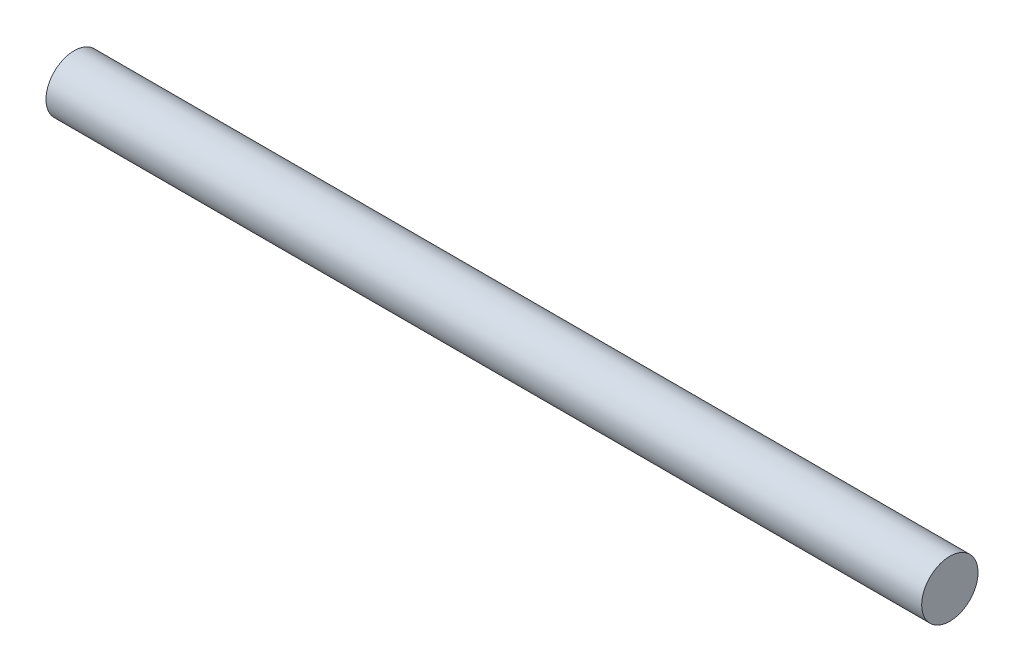
ISO-10303-21;
HEADER;
FILE_DESCRIPTION(('STEP AP214'),'2;1');
FILE_NAME('part.step','',(''),(''),'','','');
FILE_SCHEMA(('AUTOMOTIVE_DESIGN { 1 0 10303 214 1 1 1 1 }'));
ENDSEC;
DATA;
#1=APPLICATION_CONTEXT('core data for automotive mechanical design processes');
#2=APPLICATION_PROTOCOL_DEFINITION('international standard','automotive_design',2000,#1);
#3=PRODUCT_CONTEXT('',#1,'mechanical');
#4=PRODUCT('Part','Part','',(#3));
#5=PRODUCT_RELATED_PRODUCT_CATEGORY('part','',(#4));
#6=PRODUCT_DEFINITION_FORMATION('','',#4);
#7=PRODUCT_DEFINITION_CONTEXT('part definition',#1,'design');
#8=PRODUCT_DEFINITION('design','',#6,#7);
#9=PRODUCT_DEFINITION_SHAPE('','',#8);
#10=(LENGTH_UNIT() NAMED_UNIT(*) SI_UNIT(.MILLI.,.METRE.));
#11=(NAMED_UNIT(*) PLANE_ANGLE_UNIT() SI_UNIT($,.RADIAN.));
#12=(NAMED_UNIT(*) SI_UNIT($,.STERADIAN.) SOLID_ANGLE_UNIT());
#13=UNCERTAINTY_MEASURE_WITH_UNIT(LENGTH_MEASURE(1.E-05),#10,'distance_accuracy_value','');
#14=(GEOMETRIC_REPRESENTATION_CONTEXT(3) GLOBAL_UNCERTAINTY_ASSIGNED_CONTEXT((#13)) GLOBAL_UNIT_ASSIGNED_CONTEXT((#10,
#11,#12)) REPRESENTATION_CONTEXT('',''));
#15=CARTESIAN_POINT('',(0.,0.,0.));
#16=DIRECTION('',(0.,0.,1.));
#17=DIRECTION('',(1.,0.,0.));
#18=AXIS2_PLACEMENT_3D('',#15,#16,#17);
#19=CARTESIAN_POINT('',(0.,0.,0.));
#20=DIRECTION('',(-1.,0.,0.));
#21=DIRECTION('',(0.,0.,1.));
#22=AXIS2_PLACEMENT_3D('',#19,#20,#21);
#23=PLANE('',#22);
#24=CARTESIAN_POINT('',(0.,0.,0.));
#25=DIRECTION('',(-1.,0.,0.));
#26=DIRECTION('',(0.,0.,1.));
#27=AXIS2_PLACEMENT_3D('',#24,#25,#26);
#28=CIRCLE('',#27,8.5);
#29=CARTESIAN_POINT('',(0.,0.,8.5));
#30=VERTEX_POINT('',#29);
#31=EDGE_CURVE('E10',#30,#30,#28,.T.);
#32=ORIENTED_EDGE('',*,*,#31,.T.);
#33=EDGE_LOOP('',(#32));
#34=FACE_BOUND('',#33,.T.);
#35=ADVANCED_FACE('F35',(#34),#23,.T.);
#36=CARTESIAN_POINT('',(-70.4917683684246,0.,0.));
#37=DIRECTION('',(-1.,0.,0.));
#38=DIRECTION('',(0.,0.,1.));
#39=AXIS2_PLACEMENT_3D('',#36,#37,#38);
#40=CYLINDRICAL_SURFACE('',#39,8.5);
#41=CARTESIAN_POINT('',(264.,0.,0.));
#42=DIRECTION('',(-1.,0.,0.));
#43=DIRECTION('',(0.,0.,1.));
#44=AXIS2_PLACEMENT_3D('',#41,#42,#43);
#45=CIRCLE('',#44,8.5);
#46=CARTESIAN_POINT('',(264.,0.,8.5));
#47=VERTEX_POINT('',#46);
#48=EDGE_CURVE('E41',#47,#47,#45,.T.);
#49=ORIENTED_EDGE('',*,*,#48,.T.);
#50=EDGE_LOOP('',(#49));
#51=FACE_BOUND('',#50,.T.);
#52=ORIENTED_EDGE('',*,*,#31,.F.);
#53=EDGE_LOOP('',(#52));
#54=FACE_BOUND('',#53,.T.);
#55=ADVANCED_FACE('F47',(#51,#54),#40,.T.);
#56=CARTESIAN_POINT('',(264.,0.,8.5));
#57=DIRECTION('',(1.,0.,0.));
#58=DIRECTION('',(0.,0.,-1.));
#59=AXIS2_PLACEMENT_3D('',#56,#57,#58);
#60=PLANE('',#59);
#61=ORIENTED_EDGE('',*,*,#48,.F.);
#62=EDGE_LOOP('',(#61));
#63=FACE_BOUND('',#62,.T.);
#64=ADVANCED_FACE('F50',(#63),#60,.T.);
#65=CLOSED_SHELL('',(#35,#55,#64));
#66=MANIFOLD_SOLID_BREP('B2',#65);
#67=ADVANCED_BREP_SHAPE_REPRESENTATION('',(#18,#66),#14);
#68=SHAPE_DEFINITION_REPRESENTATION(#9,#67);
ENDSEC;
END-ISO-10303-21;
